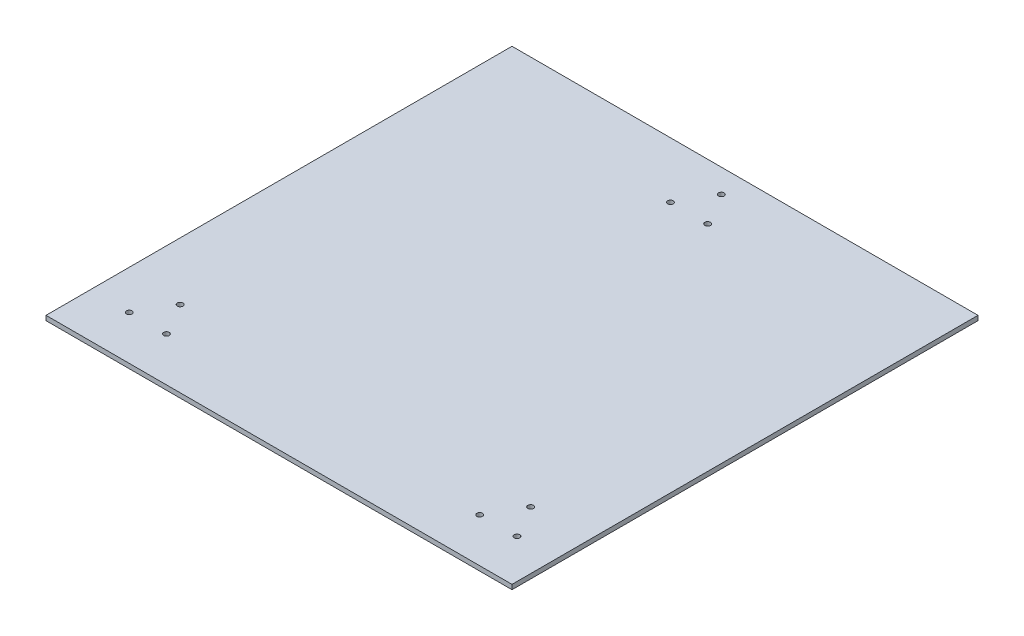
ISO-10303-21;
HEADER;
FILE_DESCRIPTION(('STEP AP214'),'2;1');
FILE_NAME('part.step','',(''),(''),'','','');
FILE_SCHEMA(('AUTOMOTIVE_DESIGN { 1 0 10303 214 1 1 1 1 }'));
ENDSEC;
DATA;
#1=APPLICATION_CONTEXT('core data for automotive mechanical design processes');
#2=APPLICATION_PROTOCOL_DEFINITION('international standard','automotive_design',2000,#1);
#3=PRODUCT_CONTEXT('',#1,'mechanical');
#4=PRODUCT('Part','Part','',(#3));
#5=PRODUCT_RELATED_PRODUCT_CATEGORY('part','',(#4));
#6=PRODUCT_DEFINITION_FORMATION('','',#4);
#7=PRODUCT_DEFINITION_CONTEXT('part definition',#1,'design');
#8=PRODUCT_DEFINITION('design','',#6,#7);
#9=PRODUCT_DEFINITION_SHAPE('','',#8);
#10=(LENGTH_UNIT() NAMED_UNIT(*) SI_UNIT(.MILLI.,.METRE.));
#11=(NAMED_UNIT(*) PLANE_ANGLE_UNIT() SI_UNIT($,.RADIAN.));
#12=(NAMED_UNIT(*) SI_UNIT($,.STERADIAN.) SOLID_ANGLE_UNIT());
#13=UNCERTAINTY_MEASURE_WITH_UNIT(LENGTH_MEASURE(1.E-05),#10,'distance_accuracy_value','');
#14=(GEOMETRIC_REPRESENTATION_CONTEXT(3) GLOBAL_UNCERTAINTY_ASSIGNED_CONTEXT((#13)) GLOBAL_UNIT_ASSIGNED_CONTEXT((#10,
#11,#12)) REPRESENTATION_CONTEXT('',''));
#15=CARTESIAN_POINT('',(0.,0.,0.));
#16=DIRECTION('',(0.,0.,1.));
#17=DIRECTION('',(1.,0.,0.));
#18=AXIS2_PLACEMENT_3D('',#15,#16,#17);
#19=CARTESIAN_POINT('',(0.,2.5,0.));
#20=DIRECTION('',(0.,-1.,0.));
#21=DIRECTION('',(0.,0.,-1.));
#22=AXIS2_PLACEMENT_3D('',#19,#20,#21);
#23=PLANE('',#22);
#24=DIRECTION('',(0.,0.,1.));
#25=VECTOR('',#24,1.);
#26=CARTESIAN_POINT('',(0.,2.5,0.));
#27=LINE('',#26,#25);
#28=CARTESIAN_POINT('',(0.,2.5,-250.));
#29=VERTEX_POINT('',#28);
#30=CARTESIAN_POINT('',(0.,2.5,0.));
#31=VERTEX_POINT('',#30);
#32=EDGE_CURVE('E92',#29,#31,#27,.T.);
#33=ORIENTED_EDGE('',*,*,#32,.T.);
#34=DIRECTION('',(1.,0.,0.));
#35=VECTOR('',#34,1.);
#36=CARTESIAN_POINT('',(0.,2.5,0.));
#37=LINE('',#36,#35);
#38=CARTESIAN_POINT('',(250.,2.5,0.));
#39=VERTEX_POINT('',#38);
#40=EDGE_CURVE('E87',#31,#39,#37,.T.);
#41=ORIENTED_EDGE('',*,*,#40,.T.);
#42=DIRECTION('',(0.,0.,-1.));
#43=VECTOR('',#42,1.);
#44=CARTESIAN_POINT('',(250.,2.5,0.));
#45=LINE('',#44,#43);
#46=CARTESIAN_POINT('',(250.,2.5,-250.));
#47=VERTEX_POINT('',#46);
#48=EDGE_CURVE('E90',#39,#47,#45,.T.);
#49=ORIENTED_EDGE('',*,*,#48,.T.);
#50=DIRECTION('',(-1.,0.,0.));
#51=VECTOR('',#50,1.);
#52=CARTESIAN_POINT('',(0.,2.5,-250.));
#53=LINE('',#52,#51);
#54=EDGE_CURVE('E57',#47,#29,#53,.T.);
#55=ORIENTED_EDGE('',*,*,#54,.T.);
#56=EDGE_LOOP('',(#33,#41,#49,#55));
#57=FACE_BOUND('',#56,.T.);
#58=CARTESIAN_POINT('',(125.,2.5,-237.3));
#59=DIRECTION('',(0.,1.,0.));
#60=DIRECTION('',(0.,0.,1.));
#61=AXIS2_PLACEMENT_3D('',#58,#59,#60);
#62=CIRCLE('',#61,1.50000000000002);
#63=CARTESIAN_POINT('',(125.,2.5,-235.8));
#64=VERTEX_POINT('',#63);
#65=EDGE_CURVE('E112',#64,#64,#62,.T.);
#66=ORIENTED_EDGE('',*,*,#65,.F.);
#67=EDGE_LOOP('',(#66));
#68=FACE_BOUND('',#67,.T.);
#69=CARTESIAN_POINT('',(135.,2.5,-219.979491924311));
#70=DIRECTION('',(0.,1.,0.));
#71=DIRECTION('',(0.,0.,1.));
#72=AXIS2_PLACEMENT_3D('',#69,#70,#71);
#73=CIRCLE('',#72,1.49999999999999);
#74=CARTESIAN_POINT('',(135.,2.5,-218.479491924311));
#75=VERTEX_POINT('',#74);
#76=EDGE_CURVE('E134',#75,#75,#73,.T.);
#77=ORIENTED_EDGE('',*,*,#76,.F.);
#78=EDGE_LOOP('',(#77));
#79=FACE_BOUND('',#78,.T.);
#80=CARTESIAN_POINT('',(115.,2.5,-219.979491924311));
#81=DIRECTION('',(0.,1.,0.));
#82=DIRECTION('',(0.,0.,1.));
#83=AXIS2_PLACEMENT_3D('',#80,#81,#82);
#84=CIRCLE('',#83,1.50000000000002);
#85=CARTESIAN_POINT('',(115.,2.5,-218.479491924311));
#86=VERTEX_POINT('',#85);
#87=EDGE_CURVE('E142',#86,#86,#84,.T.);
#88=ORIENTED_EDGE('',*,*,#87,.F.);
#89=EDGE_LOOP('',(#88));
#90=FACE_BOUND('',#89,.T.);
#91=CARTESIAN_POINT('',(30.9812021199867,2.5,-40.9810161513776));
#92=DIRECTION('',(0.,1.,0.));
#93=DIRECTION('',(0.,0.,1.));
#94=AXIS2_PLACEMENT_3D('',#91,#92,#93);
#95=CIRCLE('',#94,1.49999999999875);
#96=CARTESIAN_POINT('',(30.9812021199867,2.5,-39.4810161513788));
#97=VERTEX_POINT('',#96);
#98=EDGE_CURVE('E150',#97,#97,#95,.T.);
#99=ORIENTED_EDGE('',*,*,#98,.F.);
#100=EDGE_LOOP('',(#99));
#101=FACE_BOUND('',#100,.T.);
#102=CARTESIAN_POINT('',(40.9812021199867,2.5,-23.6605080756888));
#103=DIRECTION('',(0.,1.,0.));
#104=DIRECTION('',(0.,0.,1.));
#105=AXIS2_PLACEMENT_3D('',#102,#103,#104);
#106=CIRCLE('',#105,1.4999999999992);
#107=CARTESIAN_POINT('',(40.9812021199867,2.5,-22.1605080756896));
#108=VERTEX_POINT('',#107);
#109=EDGE_CURVE('E158',#108,#108,#106,.T.);
#110=ORIENTED_EDGE('',*,*,#109,.F.);
#111=EDGE_LOOP('',(#110));
#112=FACE_BOUND('',#111,.T.);
#113=CARTESIAN_POINT('',(20.9812021199867,2.5,-23.6605080756888));
#114=DIRECTION('',(0.,1.,0.));
#115=DIRECTION('',(0.,0.,1.));
#116=AXIS2_PLACEMENT_3D('',#113,#114,#115);
#117=CIRCLE('',#116,1.49999999999879);
#118=CARTESIAN_POINT('',(20.9812021199867,2.5,-22.16050807569));
#119=VERTEX_POINT('',#118);
#120=EDGE_CURVE('E166',#119,#119,#117,.T.);
#121=ORIENTED_EDGE('',*,*,#120,.F.);
#122=EDGE_LOOP('',(#121));
#123=FACE_BOUND('',#122,.T.);
#124=CARTESIAN_POINT('',(219.018797880013,2.5,-40.9810161513775));
#125=DIRECTION('',(0.,1.,0.));
#126=DIRECTION('',(0.,0.,1.));
#127=AXIS2_PLACEMENT_3D('',#124,#125,#126);
#128=CIRCLE('',#127,1.49999999999999);
#129=CARTESIAN_POINT('',(219.018797880013,2.5,-39.4810161513775));
#130=VERTEX_POINT('',#129);
#131=EDGE_CURVE('E174',#130,#130,#128,.T.);
#132=ORIENTED_EDGE('',*,*,#131,.F.);
#133=EDGE_LOOP('',(#132));
#134=FACE_BOUND('',#133,.T.);
#135=CARTESIAN_POINT('',(229.018797880013,2.5,-23.6605080756887));
#136=DIRECTION('',(0.,1.,0.));
#137=DIRECTION('',(0.,0.,1.));
#138=AXIS2_PLACEMENT_3D('',#135,#136,#137);
#139=CIRCLE('',#138,1.50000000000002);
#140=CARTESIAN_POINT('',(229.018797880013,2.5,-22.1605080756887));
#141=VERTEX_POINT('',#140);
#142=EDGE_CURVE('E182',#141,#141,#139,.T.);
#143=ORIENTED_EDGE('',*,*,#142,.F.);
#144=EDGE_LOOP('',(#143));
#145=FACE_BOUND('',#144,.T.);
#146=CARTESIAN_POINT('',(209.018797880013,2.5,-23.6605080756887));
#147=DIRECTION('',(0.,1.,0.));
#148=DIRECTION('',(0.,0.,1.));
#149=AXIS2_PLACEMENT_3D('',#146,#147,#148);
#150=CIRCLE('',#149,1.50000000000003);
#151=CARTESIAN_POINT('',(209.018797880013,2.5,-22.1605080756887));
#152=VERTEX_POINT('',#151);
#153=EDGE_CURVE('E190',#152,#152,#150,.T.);
#154=ORIENTED_EDGE('',*,*,#153,.F.);
#155=EDGE_LOOP('',(#154));
#156=FACE_BOUND('',#155,.T.);
#157=ADVANCED_FACE('F39',(#57,#68,#79,#90,#101,#112,#123,#134,#145,#156),#23,.F.);
#158=CARTESIAN_POINT('',(0.,0.,0.));
#159=DIRECTION('',(0.,-1.,0.));
#160=DIRECTION('',(0.,0.,-1.));
#161=AXIS2_PLACEMENT_3D('',#158,#159,#160);
#162=PLANE('',#161);
#163=CARTESIAN_POINT('',(229.018797880013,0.,-23.6605080756887));
#164=DIRECTION('',(0.,1.,0.));
#165=DIRECTION('',(0.,0.,1.));
#166=AXIS2_PLACEMENT_3D('',#163,#164,#165);
#167=CIRCLE('',#166,1.50000000000002);
#168=CARTESIAN_POINT('',(229.018797880013,0.,-22.1605080756887));
#169=VERTEX_POINT('',#168);
#170=EDGE_CURVE('E186',#169,#169,#167,.T.);
#171=ORIENTED_EDGE('',*,*,#170,.T.);
#172=EDGE_LOOP('',(#171));
#173=FACE_BOUND('',#172,.T.);
#174=CARTESIAN_POINT('',(20.9812021199867,0.,-23.6605080756888));
#175=DIRECTION('',(0.,1.,0.));
#176=DIRECTION('',(0.,0.,1.));
#177=AXIS2_PLACEMENT_3D('',#174,#175,#176);
#178=CIRCLE('',#177,1.49999999999879);
#179=CARTESIAN_POINT('',(20.9812021199867,0.,-22.16050807569));
#180=VERTEX_POINT('',#179);
#181=EDGE_CURVE('E170',#180,#180,#178,.T.);
#182=ORIENTED_EDGE('',*,*,#181,.T.);
#183=EDGE_LOOP('',(#182));
#184=FACE_BOUND('',#183,.T.);
#185=CARTESIAN_POINT('',(30.9812021199867,0.,-40.9810161513776));
#186=DIRECTION('',(0.,1.,0.));
#187=DIRECTION('',(0.,0.,1.));
#188=AXIS2_PLACEMENT_3D('',#185,#186,#187);
#189=CIRCLE('',#188,1.49999999999875);
#190=CARTESIAN_POINT('',(30.9812021199867,0.,-39.4810161513788));
#191=VERTEX_POINT('',#190);
#192=EDGE_CURVE('E154',#191,#191,#189,.T.);
#193=ORIENTED_EDGE('',*,*,#192,.T.);
#194=EDGE_LOOP('',(#193));
#195=FACE_BOUND('',#194,.T.);
#196=CARTESIAN_POINT('',(135.,0.,-219.979491924311));
#197=DIRECTION('',(0.,1.,0.));
#198=DIRECTION('',(0.,0.,1.));
#199=AXIS2_PLACEMENT_3D('',#196,#197,#198);
#200=CIRCLE('',#199,1.49999999999999);
#201=CARTESIAN_POINT('',(135.,0.,-218.479491924311));
#202=VERTEX_POINT('',#201);
#203=EDGE_CURVE('E138',#202,#202,#200,.T.);
#204=ORIENTED_EDGE('',*,*,#203,.T.);
#205=EDGE_LOOP('',(#204));
#206=FACE_BOUND('',#205,.T.);
#207=DIRECTION('',(0.,0.,1.));
#208=VECTOR('',#207,1.);
#209=CARTESIAN_POINT('',(0.,0.,0.));
#210=LINE('',#209,#208);
#211=CARTESIAN_POINT('',(0.,0.,-250.));
#212=VERTEX_POINT('',#211);
#213=CARTESIAN_POINT('',(0.,0.,0.));
#214=VERTEX_POINT('',#213);
#215=EDGE_CURVE('E108',#212,#214,#210,.T.);
#216=ORIENTED_EDGE('',*,*,#215,.F.);
#217=DIRECTION('',(-1.,0.,0.));
#218=VECTOR('',#217,1.);
#219=CARTESIAN_POINT('',(0.,0.,-250.));
#220=LINE('',#219,#218);
#221=CARTESIAN_POINT('',(250.,0.,-250.));
#222=VERTEX_POINT('',#221);
#223=EDGE_CURVE('E80',#222,#212,#220,.T.);
#224=ORIENTED_EDGE('',*,*,#223,.F.);
#225=DIRECTION('',(0.,0.,-1.));
#226=VECTOR('',#225,1.);
#227=CARTESIAN_POINT('',(250.,0.,0.));
#228=LINE('',#227,#226);
#229=CARTESIAN_POINT('',(250.,0.,0.));
#230=VERTEX_POINT('',#229);
#231=EDGE_CURVE('E74',#230,#222,#228,.T.);
#232=ORIENTED_EDGE('',*,*,#231,.F.);
#233=DIRECTION('',(1.,0.,0.));
#234=VECTOR('',#233,1.);
#235=CARTESIAN_POINT('',(0.,0.,0.));
#236=LINE('',#235,#234);
#237=EDGE_CURVE('E97',#214,#230,#236,.T.);
#238=ORIENTED_EDGE('',*,*,#237,.F.);
#239=EDGE_LOOP('',(#216,#224,#232,#238));
#240=FACE_BOUND('',#239,.T.);
#241=CARTESIAN_POINT('',(125.,0.,-237.3));
#242=DIRECTION('',(0.,1.,0.));
#243=DIRECTION('',(0.,0.,1.));
#244=AXIS2_PLACEMENT_3D('',#241,#242,#243);
#245=CIRCLE('',#244,1.50000000000002);
#246=CARTESIAN_POINT('',(125.,0.,-235.8));
#247=VERTEX_POINT('',#246);
#248=EDGE_CURVE('E130',#247,#247,#245,.T.);
#249=ORIENTED_EDGE('',*,*,#248,.T.);
#250=EDGE_LOOP('',(#249));
#251=FACE_BOUND('',#250,.T.);
#252=CARTESIAN_POINT('',(115.,0.,-219.979491924311));
#253=DIRECTION('',(0.,1.,0.));
#254=DIRECTION('',(0.,0.,1.));
#255=AXIS2_PLACEMENT_3D('',#252,#253,#254);
#256=CIRCLE('',#255,1.50000000000002);
#257=CARTESIAN_POINT('',(115.,0.,-218.479491924311));
#258=VERTEX_POINT('',#257);
#259=EDGE_CURVE('E146',#258,#258,#256,.T.);
#260=ORIENTED_EDGE('',*,*,#259,.T.);
#261=EDGE_LOOP('',(#260));
#262=FACE_BOUND('',#261,.T.);
#263=CARTESIAN_POINT('',(40.9812021199867,0.,-23.6605080756888));
#264=DIRECTION('',(0.,1.,0.));
#265=DIRECTION('',(0.,0.,1.));
#266=AXIS2_PLACEMENT_3D('',#263,#264,#265);
#267=CIRCLE('',#266,1.4999999999992);
#268=CARTESIAN_POINT('',(40.9812021199867,0.,-22.1605080756896));
#269=VERTEX_POINT('',#268);
#270=EDGE_CURVE('E162',#269,#269,#267,.T.);
#271=ORIENTED_EDGE('',*,*,#270,.T.);
#272=EDGE_LOOP('',(#271));
#273=FACE_BOUND('',#272,.T.);
#274=CARTESIAN_POINT('',(219.018797880013,0.,-40.9810161513775));
#275=DIRECTION('',(0.,1.,0.));
#276=DIRECTION('',(0.,0.,1.));
#277=AXIS2_PLACEMENT_3D('',#274,#275,#276);
#278=CIRCLE('',#277,1.49999999999999);
#279=CARTESIAN_POINT('',(219.018797880013,0.,-39.4810161513775));
#280=VERTEX_POINT('',#279);
#281=EDGE_CURVE('E178',#280,#280,#278,.T.);
#282=ORIENTED_EDGE('',*,*,#281,.T.);
#283=EDGE_LOOP('',(#282));
#284=FACE_BOUND('',#283,.T.);
#285=CARTESIAN_POINT('',(209.018797880013,0.,-23.6605080756887));
#286=DIRECTION('',(0.,1.,0.));
#287=DIRECTION('',(0.,0.,1.));
#288=AXIS2_PLACEMENT_3D('',#285,#286,#287);
#289=CIRCLE('',#288,1.50000000000003);
#290=CARTESIAN_POINT('',(209.018797880013,0.,-22.1605080756887));
#291=VERTEX_POINT('',#290);
#292=EDGE_CURVE('E194',#291,#291,#289,.T.);
#293=ORIENTED_EDGE('',*,*,#292,.T.);
#294=EDGE_LOOP('',(#293));
#295=FACE_BOUND('',#294,.T.);
#296=ADVANCED_FACE('F125',(#173,#184,#195,#206,#240,#251,#262,#273,#284,#295),#162,.T.);
#297=CARTESIAN_POINT('',(0.,2.5,0.));
#298=DIRECTION('',(1.,0.,0.));
#299=DIRECTION('',(0.,0.,-1.));
#300=AXIS2_PLACEMENT_3D('',#297,#298,#299);
#301=PLANE('',#300);
#302=ORIENTED_EDGE('',*,*,#215,.T.);
#303=DIRECTION('',(0.,-1.,0.));
#304=VECTOR('',#303,1.);
#305=CARTESIAN_POINT('',(0.,2.5,0.));
#306=LINE('',#305,#304);
#307=EDGE_CURVE('E11',#31,#214,#306,.T.);
#308=ORIENTED_EDGE('',*,*,#307,.F.);
#309=ORIENTED_EDGE('',*,*,#32,.F.);
#310=DIRECTION('',(0.,-1.,0.));
#311=VECTOR('',#310,1.);
#312=CARTESIAN_POINT('',(0.,2.5,-250.));
#313=LINE('',#312,#311);
#314=EDGE_CURVE('E104',#29,#212,#313,.T.);
#315=ORIENTED_EDGE('',*,*,#314,.T.);
#316=EDGE_LOOP('',(#302,#308,#309,#315));
#317=FACE_BOUND('',#316,.T.);
#318=ADVANCED_FACE('F41',(#317),#301,.F.);
#319=CARTESIAN_POINT('',(0.,2.5,0.));
#320=DIRECTION('',(0.,0.,-1.));
#321=DIRECTION('',(-1.,0.,0.));
#322=AXIS2_PLACEMENT_3D('',#319,#320,#321);
#323=PLANE('',#322);
#324=ORIENTED_EDGE('',*,*,#237,.T.);
#325=DIRECTION('',(0.,-1.,0.));
#326=VECTOR('',#325,1.);
#327=CARTESIAN_POINT('',(250.,2.5,0.));
#328=LINE('',#327,#326);
#329=EDGE_CURVE('E49',#39,#230,#328,.T.);
#330=ORIENTED_EDGE('',*,*,#329,.F.);
#331=ORIENTED_EDGE('',*,*,#40,.F.);
#332=ORIENTED_EDGE('',*,*,#307,.T.);
#333=EDGE_LOOP('',(#324,#330,#331,#332));
#334=FACE_BOUND('',#333,.T.);
#335=ADVANCED_FACE('F96',(#334),#323,.F.);
#336=CARTESIAN_POINT('',(250.,2.5,0.));
#337=DIRECTION('',(-1.,0.,0.));
#338=DIRECTION('',(0.,0.,1.));
#339=AXIS2_PLACEMENT_3D('',#336,#337,#338);
#340=PLANE('',#339);
#341=ORIENTED_EDGE('',*,*,#231,.T.);
#342=DIRECTION('',(0.,-1.,0.));
#343=VECTOR('',#342,1.);
#344=CARTESIAN_POINT('',(250.,2.5,-250.));
#345=LINE('',#344,#343);
#346=EDGE_CURVE('E99',#47,#222,#345,.T.);
#347=ORIENTED_EDGE('',*,*,#346,.F.);
#348=ORIENTED_EDGE('',*,*,#48,.F.);
#349=ORIENTED_EDGE('',*,*,#329,.T.);
#350=EDGE_LOOP('',(#341,#347,#348,#349));
#351=FACE_BOUND('',#350,.T.);
#352=ADVANCED_FACE('F100',(#351),#340,.F.);
#353=CARTESIAN_POINT('',(0.,2.5,-250.));
#354=DIRECTION('',(0.,0.,1.));
#355=DIRECTION('',(1.,0.,0.));
#356=AXIS2_PLACEMENT_3D('',#353,#354,#355);
#357=PLANE('',#356);
#358=ORIENTED_EDGE('',*,*,#223,.T.);
#359=ORIENTED_EDGE('',*,*,#314,.F.);
#360=ORIENTED_EDGE('',*,*,#54,.F.);
#361=ORIENTED_EDGE('',*,*,#346,.T.);
#362=EDGE_LOOP('',(#358,#359,#360,#361));
#363=FACE_BOUND('',#362,.T.);
#364=ADVANCED_FACE('F122',(#363),#357,.F.);
#365=CARTESIAN_POINT('',(125.,2.5,-237.3));
#366=DIRECTION('',(0.,-1.,0.));
#367=DIRECTION('',(0.,0.,-1.));
#368=AXIS2_PLACEMENT_3D('',#365,#366,#367);
#369=CYLINDRICAL_SURFACE('',#368,1.50000000000002);
#370=ORIENTED_EDGE('',*,*,#65,.T.);
#371=EDGE_LOOP('',(#370));
#372=FACE_BOUND('',#371,.T.);
#373=ORIENTED_EDGE('',*,*,#248,.F.);
#374=EDGE_LOOP('',(#373));
#375=FACE_BOUND('',#374,.T.);
#376=ADVANCED_FACE('F213',(#372,#375),#369,.F.);
#377=CARTESIAN_POINT('',(135.,2.5,-219.979491924311));
#378=DIRECTION('',(0.,-1.,0.));
#379=DIRECTION('',(0.,0.,-1.));
#380=AXIS2_PLACEMENT_3D('',#377,#378,#379);
#381=CYLINDRICAL_SURFACE('',#380,1.49999999999999);
#382=ORIENTED_EDGE('',*,*,#76,.T.);
#383=EDGE_LOOP('',(#382));
#384=FACE_BOUND('',#383,.T.);
#385=ORIENTED_EDGE('',*,*,#203,.F.);
#386=EDGE_LOOP('',(#385));
#387=FACE_BOUND('',#386,.T.);
#388=ADVANCED_FACE('F259',(#384,#387),#381,.F.);
#389=CARTESIAN_POINT('',(115.,2.5,-219.979491924311));
#390=DIRECTION('',(0.,-1.,0.));
#391=DIRECTION('',(0.,0.,-1.));
#392=AXIS2_PLACEMENT_3D('',#389,#390,#391);
#393=CYLINDRICAL_SURFACE('',#392,1.50000000000002);
#394=ORIENTED_EDGE('',*,*,#87,.T.);
#395=EDGE_LOOP('',(#394));
#396=FACE_BOUND('',#395,.T.);
#397=ORIENTED_EDGE('',*,*,#259,.F.);
#398=EDGE_LOOP('',(#397));
#399=FACE_BOUND('',#398,.T.);
#400=ADVANCED_FACE('F267',(#396,#399),#393,.F.);
#401=CARTESIAN_POINT('',(30.9812021199867,2.5,-40.9810161513776));
#402=DIRECTION('',(0.,-1.,0.));
#403=DIRECTION('',(0.,0.,-1.));
#404=AXIS2_PLACEMENT_3D('',#401,#402,#403);
#405=CYLINDRICAL_SURFACE('',#404,1.49999999999875);
#406=ORIENTED_EDGE('',*,*,#98,.T.);
#407=EDGE_LOOP('',(#406));
#408=FACE_BOUND('',#407,.T.);
#409=ORIENTED_EDGE('',*,*,#192,.F.);
#410=EDGE_LOOP('',(#409));
#411=FACE_BOUND('',#410,.T.);
#412=ADVANCED_FACE('F275',(#408,#411),#405,.F.);
#413=CARTESIAN_POINT('',(40.9812021199867,2.5,-23.6605080756888));
#414=DIRECTION('',(0.,-1.,0.));
#415=DIRECTION('',(0.,0.,-1.));
#416=AXIS2_PLACEMENT_3D('',#413,#414,#415);
#417=CYLINDRICAL_SURFACE('',#416,1.4999999999992);
#418=ORIENTED_EDGE('',*,*,#109,.T.);
#419=EDGE_LOOP('',(#418));
#420=FACE_BOUND('',#419,.T.);
#421=ORIENTED_EDGE('',*,*,#270,.F.);
#422=EDGE_LOOP('',(#421));
#423=FACE_BOUND('',#422,.T.);
#424=ADVANCED_FACE('F284',(#420,#423),#417,.F.);
#425=CARTESIAN_POINT('',(20.9812021199867,2.5,-23.6605080756888));
#426=DIRECTION('',(0.,-1.,0.));
#427=DIRECTION('',(0.,0.,-1.));
#428=AXIS2_PLACEMENT_3D('',#425,#426,#427);
#429=CYLINDRICAL_SURFACE('',#428,1.49999999999879);
#430=ORIENTED_EDGE('',*,*,#120,.T.);
#431=EDGE_LOOP('',(#430));
#432=FACE_BOUND('',#431,.T.);
#433=ORIENTED_EDGE('',*,*,#181,.F.);
#434=EDGE_LOOP('',(#433));
#435=FACE_BOUND('',#434,.T.);
#436=ADVANCED_FACE('F293',(#432,#435),#429,.F.);
#437=CARTESIAN_POINT('',(219.018797880013,2.5,-40.9810161513775));
#438=DIRECTION('',(0.,-1.,0.));
#439=DIRECTION('',(0.,0.,-1.));
#440=AXIS2_PLACEMENT_3D('',#437,#438,#439);
#441=CYLINDRICAL_SURFACE('',#440,1.49999999999999);
#442=ORIENTED_EDGE('',*,*,#131,.T.);
#443=EDGE_LOOP('',(#442));
#444=FACE_BOUND('',#443,.T.);
#445=ORIENTED_EDGE('',*,*,#281,.F.);
#446=EDGE_LOOP('',(#445));
#447=FACE_BOUND('',#446,.T.);
#448=ADVANCED_FACE('F302',(#444,#447),#441,.F.);
#449=CARTESIAN_POINT('',(229.018797880013,2.5,-23.6605080756887));
#450=DIRECTION('',(0.,-1.,0.));
#451=DIRECTION('',(0.,0.,-1.));
#452=AXIS2_PLACEMENT_3D('',#449,#450,#451);
#453=CYLINDRICAL_SURFACE('',#452,1.50000000000002);
#454=ORIENTED_EDGE('',*,*,#142,.T.);
#455=EDGE_LOOP('',(#454));
#456=FACE_BOUND('',#455,.T.);
#457=ORIENTED_EDGE('',*,*,#170,.F.);
#458=EDGE_LOOP('',(#457));
#459=FACE_BOUND('',#458,.T.);
#460=ADVANCED_FACE('F311',(#456,#459),#453,.F.);
#461=CARTESIAN_POINT('',(209.018797880013,2.5,-23.6605080756887));
#462=DIRECTION('',(0.,-1.,0.));
#463=DIRECTION('',(0.,0.,-1.));
#464=AXIS2_PLACEMENT_3D('',#461,#462,#463);
#465=CYLINDRICAL_SURFACE('',#464,1.50000000000003);
#466=ORIENTED_EDGE('',*,*,#153,.T.);
#467=EDGE_LOOP('',(#466));
#468=FACE_BOUND('',#467,.T.);
#469=ORIENTED_EDGE('',*,*,#292,.F.);
#470=EDGE_LOOP('',(#469));
#471=FACE_BOUND('',#470,.T.);
#472=ADVANCED_FACE('F202',(#468,#471),#465,.F.);
#473=CLOSED_SHELL('',(#157,#296,#318,#335,#352,#364,#376,#388,#400,#412,#424,#436,#448,#460,#472));
#474=MANIFOLD_SOLID_BREP('B2',#473);
#475=ADVANCED_BREP_SHAPE_REPRESENTATION('',(#18,#474),#14);
#476=SHAPE_DEFINITION_REPRESENTATION(#9,#475);
ENDSEC;
END-ISO-10303-21;
